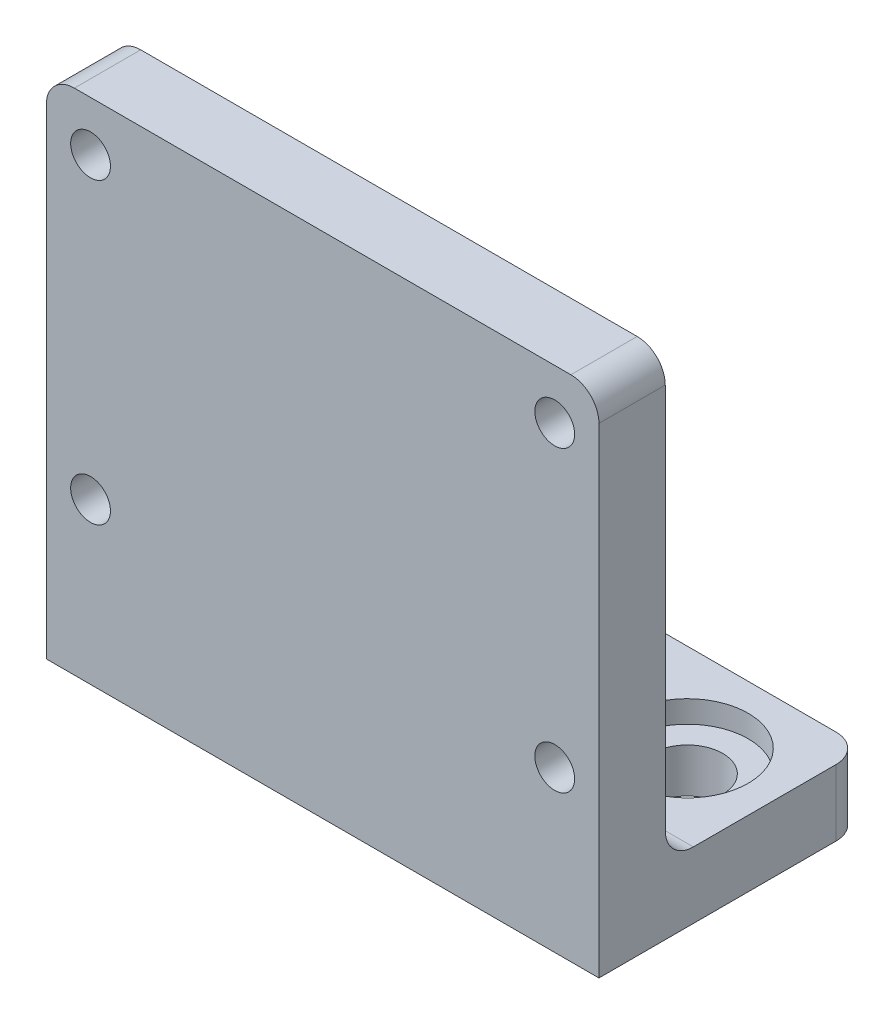
ISO-10303-21;
HEADER;
FILE_DESCRIPTION(('STEP AP214'),'2;1');
FILE_NAME('part.step','',(''),(''),'','','');
FILE_SCHEMA(('AUTOMOTIVE_DESIGN { 1 0 10303 214 1 1 1 1 }'));
ENDSEC;
DATA;
#1=APPLICATION_CONTEXT('core data for automotive mechanical design processes');
#2=APPLICATION_PROTOCOL_DEFINITION('international standard','automotive_design',2000,#1);
#3=PRODUCT_CONTEXT('',#1,'mechanical');
#4=PRODUCT('Part','Part','',(#3));
#5=PRODUCT_RELATED_PRODUCT_CATEGORY('part','',(#4));
#6=PRODUCT_DEFINITION_FORMATION('','',#4);
#7=PRODUCT_DEFINITION_CONTEXT('part definition',#1,'design');
#8=PRODUCT_DEFINITION('design','',#6,#7);
#9=PRODUCT_DEFINITION_SHAPE('','',#8);
#10=(LENGTH_UNIT() NAMED_UNIT(*) SI_UNIT(.MILLI.,.METRE.));
#11=(NAMED_UNIT(*) PLANE_ANGLE_UNIT() SI_UNIT($,.RADIAN.));
#12=(NAMED_UNIT(*) SI_UNIT($,.STERADIAN.) SOLID_ANGLE_UNIT());
#13=UNCERTAINTY_MEASURE_WITH_UNIT(LENGTH_MEASURE(1.E-05),#10,'distance_accuracy_value','');
#14=(GEOMETRIC_REPRESENTATION_CONTEXT(3) GLOBAL_UNCERTAINTY_ASSIGNED_CONTEXT((#13)) GLOBAL_UNIT_ASSIGNED_CONTEXT((#10,
#11,#12)) REPRESENTATION_CONTEXT('',''));
#15=CARTESIAN_POINT('',(0.,0.,0.));
#16=DIRECTION('',(0.,0.,1.));
#17=DIRECTION('',(1.,0.,0.));
#18=AXIS2_PLACEMENT_3D('',#15,#16,#17);
#19=CARTESIAN_POINT('',(-12.5,-14.,-3.));
#20=DIRECTION('',(-1.,0.,0.));
#21=DIRECTION('',(0.,0.,1.));
#22=AXIS2_PLACEMENT_3D('',#19,#20,#21);
#23=PLANE('',#22);
#24=DIRECTION('',(0.,0.,1.));
#25=VECTOR('',#24,1.);
#26=CARTESIAN_POINT('',(-12.5,-11.,-12.));
#27=LINE('',#26,#25);
#28=CARTESIAN_POINT('',(-12.5,-11.,-10.73));
#29=VERTEX_POINT('',#28);
#30=CARTESIAN_POINT('',(-12.5,-11.,-4.27));
#31=VERTEX_POINT('',#30);
#32=EDGE_CURVE('E384',#29,#31,#27,.T.);
#33=ORIENTED_EDGE('',*,*,#32,.F.);
#34=DIRECTION('',(0.,1.,0.));
#35=VECTOR('',#34,1.);
#36=CARTESIAN_POINT('',(-12.5,-14.,-10.73));
#37=LINE('',#36,#35);
#38=CARTESIAN_POINT('',(-12.5,-14.,-10.73));
#39=VERTEX_POINT('',#38);
#40=EDGE_CURVE('E181',#29,#39,#37,.F.);
#41=ORIENTED_EDGE('',*,*,#40,.T.);
#42=DIRECTION('',(0.,0.,1.));
#43=VECTOR('',#42,1.);
#44=CARTESIAN_POINT('',(-12.5,-14.,-3.));
#45=LINE('',#44,#43);
#46=CARTESIAN_POINT('',(-12.5,-14.,0.));
#47=VERTEX_POINT('',#46);
#48=EDGE_CURVE('E178',#39,#47,#45,.T.);
#49=ORIENTED_EDGE('',*,*,#48,.T.);
#50=DIRECTION('',(0.,-1.,0.));
#51=VECTOR('',#50,1.);
#52=CARTESIAN_POINT('',(-12.5,-14.,0.));
#53=LINE('',#52,#51);
#54=CARTESIAN_POINT('',(-12.5,7.73000000000001,0.));
#55=VERTEX_POINT('',#54);
#56=EDGE_CURVE('E164',#55,#47,#53,.T.);
#57=ORIENTED_EDGE('',*,*,#56,.F.);
#58=DIRECTION('',(0.,0.,1.));
#59=VECTOR('',#58,1.);
#60=CARTESIAN_POINT('',(-12.5,7.73000000000001,-3.));
#61=LINE('',#60,#59);
#62=CARTESIAN_POINT('',(-12.5,7.73000000000001,-3.));
#63=VERTEX_POINT('',#62);
#64=EDGE_CURVE('E279',#55,#63,#61,.F.);
#65=ORIENTED_EDGE('',*,*,#64,.T.);
#66=DIRECTION('',(0.,1.,0.));
#67=VECTOR('',#66,1.);
#68=CARTESIAN_POINT('',(-12.5,-11.,-3.));
#69=LINE('',#68,#67);
#70=CARTESIAN_POINT('',(-12.5,-9.72999999999998,-3.));
#71=VERTEX_POINT('',#70);
#72=EDGE_CURVE('E389',#71,#63,#69,.T.);
#73=ORIENTED_EDGE('',*,*,#72,.F.);
#74=CARTESIAN_POINT('',(-12.5,-9.72999999999998,-4.27));
#75=DIRECTION('',(-1.,0.,0.));
#76=DIRECTION('',(0.,0.,1.));
#77=AXIS2_PLACEMENT_3D('',#74,#75,#76);
#78=CIRCLE('',#77,1.27);
#79=EDGE_CURVE('E12',#71,#31,#78,.F.);
#80=ORIENTED_EDGE('',*,*,#79,.T.);
#81=EDGE_LOOP('',(#33,#41,#49,#57,#65,#73,#80));
#82=FACE_BOUND('',#81,.T.);
#83=ADVANCED_FACE('F41',(#82),#23,.T.);
#84=CARTESIAN_POINT('',(-12.5,9.00000000000001,-3.));
#85=DIRECTION('',(0.,1.,0.));
#86=DIRECTION('',(0.,0.,1.));
#87=AXIS2_PLACEMENT_3D('',#84,#85,#86);
#88=PLANE('',#87);
#89=DIRECTION('',(1.,0.,0.));
#90=VECTOR('',#89,1.);
#91=CARTESIAN_POINT('',(-1.,9.00000000000001,-3.));
#92=LINE('',#91,#90);
#93=CARTESIAN_POINT('',(-11.23,9.00000000000001,-3.));
#94=VERTEX_POINT('',#93);
#95=CARTESIAN_POINT('',(-2.27,9.00000000000001,-3.));
#96=VERTEX_POINT('',#95);
#97=EDGE_CURVE('E385',#94,#96,#92,.T.);
#98=ORIENTED_EDGE('',*,*,#97,.F.);
#99=DIRECTION('',(0.,0.,1.));
#100=VECTOR('',#99,1.);
#101=CARTESIAN_POINT('',(-11.23,9.00000000000001,-3.));
#102=LINE('',#101,#100);
#103=CARTESIAN_POINT('',(-11.23,9.00000000000001,0.));
#104=VERTEX_POINT('',#103);
#105=EDGE_CURVE('E301',#94,#104,#102,.T.);
#106=ORIENTED_EDGE('',*,*,#105,.T.);
#107=DIRECTION('',(-1.,0.,0.));
#108=VECTOR('',#107,1.);
#109=CARTESIAN_POINT('',(-12.5,9.00000000000001,0.));
#110=LINE('',#109,#108);
#111=CARTESIAN_POINT('',(11.23,9.00000000000001,0.));
#112=VERTEX_POINT('',#111);
#113=EDGE_CURVE('E195',#112,#104,#110,.T.);
#114=ORIENTED_EDGE('',*,*,#113,.F.);
#115=DIRECTION('',(0.,0.,1.));
#116=VECTOR('',#115,1.);
#117=CARTESIAN_POINT('',(11.23,9.00000000000001,-3.));
#118=LINE('',#117,#116);
#119=CARTESIAN_POINT('',(11.23,9.00000000000001,-3.));
#120=VERTEX_POINT('',#119);
#121=EDGE_CURVE('E298',#112,#120,#118,.F.);
#122=ORIENTED_EDGE('',*,*,#121,.T.);
#123=DIRECTION('',(-1.,0.,0.));
#124=VECTOR('',#123,1.);
#125=CARTESIAN_POINT('',(-12.5,9.00000000000001,-3.));
#126=LINE('',#125,#124);
#127=CARTESIAN_POINT('',(2.27,9.00000000000001,-3.));
#128=VERTEX_POINT('',#127);
#129=EDGE_CURVE('E186',#120,#128,#126,.T.);
#130=ORIENTED_EDGE('',*,*,#129,.T.);
#131=EDGE_CURVE('E60',#128,#96,#126,.T.);
#132=ORIENTED_EDGE('',*,*,#131,.T.);
#133=EDGE_LOOP('',(#98,#106,#114,#122,#130,#132));
#134=FACE_BOUND('',#133,.T.);
#135=ADVANCED_FACE('F446',(#134),#88,.T.);
#136=CARTESIAN_POINT('',(12.5,-14.,-3.));
#137=DIRECTION('',(1.,0.,0.));
#138=DIRECTION('',(0.,0.,-1.));
#139=AXIS2_PLACEMENT_3D('',#136,#137,#138);
#140=PLANE('',#139);
#141=DIRECTION('',(0.,0.,1.));
#142=VECTOR('',#141,1.);
#143=CARTESIAN_POINT('',(12.5,-14.,-3.));
#144=LINE('',#143,#142);
#145=CARTESIAN_POINT('',(12.5,-14.,-10.73));
#146=VERTEX_POINT('',#145);
#147=CARTESIAN_POINT('',(12.5,-14.,0.));
#148=VERTEX_POINT('',#147);
#149=EDGE_CURVE('E185',#146,#148,#144,.T.);
#150=ORIENTED_EDGE('',*,*,#149,.F.);
#151=DIRECTION('',(0.,1.,0.));
#152=VECTOR('',#151,1.);
#153=CARTESIAN_POINT('',(12.5,-11.,-10.73));
#154=LINE('',#153,#152);
#155=CARTESIAN_POINT('',(12.5,-11.,-10.73));
#156=VERTEX_POINT('',#155);
#157=EDGE_CURVE('E294',#146,#156,#154,.T.);
#158=ORIENTED_EDGE('',*,*,#157,.T.);
#159=DIRECTION('',(0.,0.,-1.));
#160=VECTOR('',#159,1.);
#161=CARTESIAN_POINT('',(12.5,-11.,-3.));
#162=LINE('',#161,#160);
#163=CARTESIAN_POINT('',(12.5,-11.,-4.27));
#164=VERTEX_POINT('',#163);
#165=EDGE_CURVE('E400',#164,#156,#162,.T.);
#166=ORIENTED_EDGE('',*,*,#165,.F.);
#167=CARTESIAN_POINT('',(12.5,-9.72999999999998,-4.27));
#168=DIRECTION('',(1.,0.,0.));
#169=DIRECTION('',(0.,0.,-1.));
#170=AXIS2_PLACEMENT_3D('',#167,#168,#169);
#171=CIRCLE('',#170,1.27);
#172=CARTESIAN_POINT('',(12.5,-9.72999999999998,-3.));
#173=VERTEX_POINT('',#172);
#174=EDGE_CURVE('E317',#164,#173,#171,.F.);
#175=ORIENTED_EDGE('',*,*,#174,.T.);
#176=DIRECTION('',(0.,1.,0.));
#177=VECTOR('',#176,1.);
#178=CARTESIAN_POINT('',(12.5,-11.,-3.));
#179=LINE('',#178,#177);
#180=CARTESIAN_POINT('',(12.5,7.73000000000001,-3.));
#181=VERTEX_POINT('',#180);
#182=EDGE_CURVE('E391',#173,#181,#179,.T.);
#183=ORIENTED_EDGE('',*,*,#182,.T.);
#184=DIRECTION('',(0.,0.,1.));
#185=VECTOR('',#184,1.);
#186=CARTESIAN_POINT('',(12.5,7.73000000000001,-3.));
#187=LINE('',#186,#185);
#188=CARTESIAN_POINT('',(12.5,7.73000000000001,0.));
#189=VERTEX_POINT('',#188);
#190=EDGE_CURVE('E290',#181,#189,#187,.T.);
#191=ORIENTED_EDGE('',*,*,#190,.T.);
#192=DIRECTION('',(0.,1.,0.));
#193=VECTOR('',#192,1.);
#194=CARTESIAN_POINT('',(12.5,-14.,0.));
#195=LINE('',#194,#193);
#196=EDGE_CURVE('E192',#148,#189,#195,.T.);
#197=ORIENTED_EDGE('',*,*,#196,.F.);
#198=EDGE_LOOP('',(#150,#158,#166,#175,#183,#191,#197));
#199=FACE_BOUND('',#198,.T.);
#200=ADVANCED_FACE('F457',(#199),#140,.T.);
#201=CARTESIAN_POINT('',(-12.5,-14.,-3.));
#202=DIRECTION('',(0.,-1.,0.));
#203=DIRECTION('',(0.,0.,-1.));
#204=AXIS2_PLACEMENT_3D('',#201,#202,#203);
#205=PLANE('',#204);
#206=CARTESIAN_POINT('',(-8.49999999999996,-14.,-8.));
#207=DIRECTION('',(0.,1.,0.));
#208=DIRECTION('',(0.,0.,1.));
#209=AXIS2_PLACEMENT_3D('',#206,#207,#208);
#210=CIRCLE('',#209,1.6);
#211=CARTESIAN_POINT('',(-8.49999999999996,-14.,-6.4));
#212=VERTEX_POINT('',#211);
#213=EDGE_CURVE('E404',#212,#212,#210,.T.);
#214=ORIENTED_EDGE('',*,*,#213,.T.);
#215=EDGE_LOOP('',(#214));
#216=FACE_BOUND('',#215,.T.);
#217=CARTESIAN_POINT('',(8.49999999999996,-14.,-8.));
#218=DIRECTION('',(0.,1.,0.));
#219=DIRECTION('',(0.,0.,-1.));
#220=AXIS2_PLACEMENT_3D('',#217,#218,#219);
#221=CIRCLE('',#220,1.6);
#222=CARTESIAN_POINT('',(8.49999999999996,-14.,-9.6));
#223=VERTEX_POINT('',#222);
#224=EDGE_CURVE('E221',#223,#223,#221,.T.);
#225=ORIENTED_EDGE('',*,*,#224,.T.);
#226=EDGE_LOOP('',(#225));
#227=FACE_BOUND('',#226,.T.);
#228=ORIENTED_EDGE('',*,*,#48,.F.);
#229=CARTESIAN_POINT('',(-11.23,-14.,-10.73));
#230=DIRECTION('',(0.,-1.,0.));
#231=DIRECTION('',(0.,0.,-1.));
#232=AXIS2_PLACEMENT_3D('',#229,#230,#231);
#233=CIRCLE('',#232,1.27);
#234=CARTESIAN_POINT('',(-11.23,-14.,-12.));
#235=VERTEX_POINT('',#234);
#236=EDGE_CURVE('E287',#39,#235,#233,.T.);
#237=ORIENTED_EDGE('',*,*,#236,.T.);
#238=DIRECTION('',(-1.,0.,0.));
#239=VECTOR('',#238,1.);
#240=CARTESIAN_POINT('',(37.1981780704569,-14.,-12.));
#241=LINE('',#240,#239);
#242=CARTESIAN_POINT('',(11.23,-14.,-12.));
#243=VERTEX_POINT('',#242);
#244=EDGE_CURVE('E408',#243,#235,#241,.T.);
#245=ORIENTED_EDGE('',*,*,#244,.F.);
#246=CARTESIAN_POINT('',(11.23,-14.,-10.73));
#247=DIRECTION('',(0.,-1.,0.));
#248=DIRECTION('',(0.,0.,-1.));
#249=AXIS2_PLACEMENT_3D('',#246,#247,#248);
#250=CIRCLE('',#249,1.27);
#251=EDGE_CURVE('E284',#243,#146,#250,.T.);
#252=ORIENTED_EDGE('',*,*,#251,.T.);
#253=ORIENTED_EDGE('',*,*,#149,.T.);
#254=DIRECTION('',(1.,0.,0.));
#255=VECTOR('',#254,1.);
#256=CARTESIAN_POINT('',(-12.5,-14.,0.));
#257=LINE('',#256,#255);
#258=EDGE_CURVE('E170',#47,#148,#257,.T.);
#259=ORIENTED_EDGE('',*,*,#258,.F.);
#260=EDGE_LOOP('',(#228,#237,#245,#252,#253,#259));
#261=FACE_BOUND('',#260,.T.);
#262=ADVANCED_FACE('F188',(#216,#227,#261),#205,.T.);
#263=CARTESIAN_POINT('',(0.,0.,0.));
#264=DIRECTION('',(0.,0.,-1.));
#265=DIRECTION('',(-1.,0.,0.));
#266=AXIS2_PLACEMENT_3D('',#263,#264,#265);
#267=PLANE('',#266);
#268=CARTESIAN_POINT('',(-10.5,-6.75000000000001,0.));
#269=DIRECTION('',(0.,0.,1.));
#270=DIRECTION('',(1.,0.,0.));
#271=AXIS2_PLACEMENT_3D('',#268,#269,#270);
#272=CIRCLE('',#271,0.90000000000001);
#273=CARTESIAN_POINT('',(-9.59999999999995,-6.75000000000001,0.));
#274=VERTEX_POINT('',#273);
#275=EDGE_CURVE('E415',#274,#274,#272,.T.);
#276=ORIENTED_EDGE('',*,*,#275,.F.);
#277=EDGE_LOOP('',(#276));
#278=FACE_BOUND('',#277,.T.);
#279=CARTESIAN_POINT('',(10.5,-6.75000000000001,0.));
#280=DIRECTION('',(0.,0.,1.));
#281=DIRECTION('',(1.,0.,0.));
#282=AXIS2_PLACEMENT_3D('',#279,#280,#281);
#283=CIRCLE('',#282,0.90000000000001);
#284=CARTESIAN_POINT('',(11.4,-6.75000000000001,0.));
#285=VERTEX_POINT('',#284);
#286=EDGE_CURVE('E424',#285,#285,#283,.T.);
#287=ORIENTED_EDGE('',*,*,#286,.F.);
#288=EDGE_LOOP('',(#287));
#289=FACE_BOUND('',#288,.T.);
#290=CARTESIAN_POINT('',(10.5,6.75000000000001,0.));
#291=DIRECTION('',(0.,0.,1.));
#292=DIRECTION('',(1.,0.,0.));
#293=AXIS2_PLACEMENT_3D('',#290,#291,#292);
#294=CIRCLE('',#293,0.90000000000001);
#295=CARTESIAN_POINT('',(11.4,6.75000000000001,0.));
#296=VERTEX_POINT('',#295);
#297=EDGE_CURVE('E431',#296,#296,#294,.T.);
#298=ORIENTED_EDGE('',*,*,#297,.F.);
#299=EDGE_LOOP('',(#298));
#300=FACE_BOUND('',#299,.T.);
#301=CARTESIAN_POINT('',(-10.5,6.75000000000001,0.));
#302=DIRECTION('',(0.,0.,1.));
#303=DIRECTION('',(1.,0.,0.));
#304=AXIS2_PLACEMENT_3D('',#301,#302,#303);
#305=CIRCLE('',#304,0.90000000000001);
#306=CARTESIAN_POINT('',(-9.59999999999995,6.75000000000001,0.));
#307=VERTEX_POINT('',#306);
#308=EDGE_CURVE('E175',#307,#307,#305,.T.);
#309=ORIENTED_EDGE('',*,*,#308,.F.);
#310=EDGE_LOOP('',(#309));
#311=FACE_BOUND('',#310,.T.);
#312=ORIENTED_EDGE('',*,*,#113,.T.);
#313=CARTESIAN_POINT('',(-11.23,7.73000000000001,0.));
#314=DIRECTION('',(0.,0.,-1.));
#315=DIRECTION('',(-1.,0.,0.));
#316=AXIS2_PLACEMENT_3D('',#313,#314,#315);
#317=CIRCLE('',#316,1.27);
#318=EDGE_CURVE('E171',#104,#55,#317,.F.);
#319=ORIENTED_EDGE('',*,*,#318,.T.);
#320=ORIENTED_EDGE('',*,*,#56,.T.);
#321=ORIENTED_EDGE('',*,*,#258,.T.);
#322=ORIENTED_EDGE('',*,*,#196,.T.);
#323=CARTESIAN_POINT('',(11.23,7.73000000000001,0.));
#324=DIRECTION('',(0.,0.,-1.));
#325=DIRECTION('',(-1.,0.,0.));
#326=AXIS2_PLACEMENT_3D('',#323,#324,#325);
#327=CIRCLE('',#326,1.27);
#328=EDGE_CURVE('E305',#189,#112,#327,.F.);
#329=ORIENTED_EDGE('',*,*,#328,.T.);
#330=EDGE_LOOP('',(#312,#319,#320,#321,#322,#329));
#331=FACE_BOUND('',#330,.T.);
#332=ADVANCED_FACE('F167',(#278,#289,#300,#311,#331),#267,.F.);
#333=CARTESIAN_POINT('',(-10.5,6.75000000000001,-3.));
#334=DIRECTION('',(0.,0.,1.));
#335=DIRECTION('',(1.,0.,0.));
#336=AXIS2_PLACEMENT_3D('',#333,#334,#335);
#337=CYLINDRICAL_SURFACE('',#336,0.90000000000001);
#338=CARTESIAN_POINT('',(-10.5,6.75000000000001,-3.));
#339=DIRECTION('',(0.,0.,1.));
#340=DIRECTION('',(1.,0.,0.));
#341=AXIS2_PLACEMENT_3D('',#338,#339,#340);
#342=CIRCLE('',#341,0.90000000000001);
#343=CARTESIAN_POINT('',(-9.59999999999995,6.75000000000001,-3.));
#344=VERTEX_POINT('',#343);
#345=EDGE_CURVE('E411',#344,#344,#342,.T.);
#346=ORIENTED_EDGE('',*,*,#345,.F.);
#347=EDGE_LOOP('',(#346));
#348=FACE_BOUND('',#347,.T.);
#349=ORIENTED_EDGE('',*,*,#308,.T.);
#350=EDGE_LOOP('',(#349));
#351=FACE_BOUND('',#350,.T.);
#352=ADVANCED_FACE('F684',(#348,#351),#337,.F.);
#353=CARTESIAN_POINT('',(10.5,6.75000000000001,-3.));
#354=DIRECTION('',(0.,0.,1.));
#355=DIRECTION('',(1.,0.,0.));
#356=AXIS2_PLACEMENT_3D('',#353,#354,#355);
#357=CYLINDRICAL_SURFACE('',#356,0.90000000000001);
#358=CARTESIAN_POINT('',(10.5,6.75000000000001,-3.));
#359=DIRECTION('',(0.,0.,1.));
#360=DIRECTION('',(1.,0.,0.));
#361=AXIS2_PLACEMENT_3D('',#358,#359,#360);
#362=CIRCLE('',#361,0.90000000000001);
#363=CARTESIAN_POINT('',(11.4,6.75000000000001,-3.));
#364=VERTEX_POINT('',#363);
#365=EDGE_CURVE('E420',#364,#364,#362,.T.);
#366=ORIENTED_EDGE('',*,*,#365,.F.);
#367=EDGE_LOOP('',(#366));
#368=FACE_BOUND('',#367,.T.);
#369=ORIENTED_EDGE('',*,*,#297,.T.);
#370=EDGE_LOOP('',(#369));
#371=FACE_BOUND('',#370,.T.);
#372=ADVANCED_FACE('F786',(#368,#371),#357,.F.);
#373=CARTESIAN_POINT('',(10.5,-6.75000000000001,-3.));
#374=DIRECTION('',(0.,0.,1.));
#375=DIRECTION('',(1.,0.,0.));
#376=AXIS2_PLACEMENT_3D('',#373,#374,#375);
#377=CYLINDRICAL_SURFACE('',#376,0.90000000000001);
#378=CARTESIAN_POINT('',(10.5,-6.75000000000001,-3.));
#379=DIRECTION('',(0.,0.,1.));
#380=DIRECTION('',(1.,0.,0.));
#381=AXIS2_PLACEMENT_3D('',#378,#379,#380);
#382=CIRCLE('',#381,0.90000000000001);
#383=CARTESIAN_POINT('',(11.4,-6.75000000000001,-3.));
#384=VERTEX_POINT('',#383);
#385=EDGE_CURVE('E399',#384,#384,#382,.T.);
#386=ORIENTED_EDGE('',*,*,#385,.F.);
#387=EDGE_LOOP('',(#386));
#388=FACE_BOUND('',#387,.T.);
#389=ORIENTED_EDGE('',*,*,#286,.T.);
#390=EDGE_LOOP('',(#389));
#391=FACE_BOUND('',#390,.T.);
#392=ADVANCED_FACE('F776',(#388,#391),#377,.F.);
#393=CARTESIAN_POINT('',(-10.5,-6.75000000000001,-3.));
#394=DIRECTION('',(0.,0.,1.));
#395=DIRECTION('',(1.,0.,0.));
#396=AXIS2_PLACEMENT_3D('',#393,#394,#395);
#397=CYLINDRICAL_SURFACE('',#396,0.90000000000001);
#398=CARTESIAN_POINT('',(-10.5,-6.75000000000001,-3.));
#399=DIRECTION('',(0.,0.,1.));
#400=DIRECTION('',(1.,0.,0.));
#401=AXIS2_PLACEMENT_3D('',#398,#399,#400);
#402=CIRCLE('',#401,0.90000000000001);
#403=CARTESIAN_POINT('',(-9.59999999999995,-6.75000000000001,-3.));
#404=VERTEX_POINT('',#403);
#405=EDGE_CURVE('E416',#404,#404,#402,.T.);
#406=ORIENTED_EDGE('',*,*,#405,.F.);
#407=EDGE_LOOP('',(#406));
#408=FACE_BOUND('',#407,.T.);
#409=ORIENTED_EDGE('',*,*,#275,.T.);
#410=EDGE_LOOP('',(#409));
#411=FACE_BOUND('',#410,.T.);
#412=ADVANCED_FACE('F673',(#408,#411),#397,.F.);
#413=CARTESIAN_POINT('',(37.1981780704569,-11.,-12.));
#414=DIRECTION('',(0.,0.,1.));
#415=DIRECTION('',(0.,-1.,0.));
#416=AXIS2_PLACEMENT_3D('',#413,#414,#415);
#417=PLANE('',#416);
#418=ORIENTED_EDGE('',*,*,#244,.T.);
#419=DIRECTION('',(0.,1.,0.));
#420=VECTOR('',#419,1.);
#421=CARTESIAN_POINT('',(-11.23,-11.,-12.));
#422=LINE('',#421,#420);
#423=CARTESIAN_POINT('',(-11.23,-11.,-12.));
#424=VERTEX_POINT('',#423);
#425=EDGE_CURVE('E275',#235,#424,#422,.T.);
#426=ORIENTED_EDGE('',*,*,#425,.T.);
#427=DIRECTION('',(-1.,0.,0.));
#428=VECTOR('',#427,1.);
#429=CARTESIAN_POINT('',(-1.,-11.,-12.));
#430=LINE('',#429,#428);
#431=CARTESIAN_POINT('',(-2.27,-11.,-12.));
#432=VERTEX_POINT('',#431);
#433=EDGE_CURVE('E375',#432,#424,#430,.T.);
#434=ORIENTED_EDGE('',*,*,#433,.F.);
#435=DIRECTION('',(-1.,0.,0.));
#436=VECTOR('',#435,1.);
#437=CARTESIAN_POINT('',(37.1981780704569,-11.,-12.));
#438=LINE('',#437,#436);
#439=CARTESIAN_POINT('',(2.27,-11.,-12.));
#440=VERTEX_POINT('',#439);
#441=EDGE_CURVE('E367',#440,#432,#438,.T.);
#442=ORIENTED_EDGE('',*,*,#441,.F.);
#443=CARTESIAN_POINT('',(11.23,-11.,-12.));
#444=VERTEX_POINT('',#443);
#445=EDGE_CURVE('E412',#444,#440,#438,.T.);
#446=ORIENTED_EDGE('',*,*,#445,.F.);
#447=DIRECTION('',(0.,1.,0.));
#448=VECTOR('',#447,1.);
#449=CARTESIAN_POINT('',(11.23,-14.,-12.));
#450=LINE('',#449,#448);
#451=EDGE_CURVE('E272',#444,#243,#450,.F.);
#452=ORIENTED_EDGE('',*,*,#451,.T.);
#453=EDGE_LOOP('',(#418,#426,#434,#442,#446,#452));
#454=FACE_BOUND('',#453,.T.);
#455=ADVANCED_FACE('F379',(#454),#417,.F.);
#456=CARTESIAN_POINT('',(37.1981780704569,9.00000000000001,-3.));
#457=DIRECTION('',(0.,-0.410364677328798,0.911921505175106));
#458=DIRECTION('',(0.,-0.911921505175106,-0.410364677328798));
#459=AXIS2_PLACEMENT_3D('',#456,#457,#458);
#460=PLANE('',#459);
#461=ORIENTED_EDGE('',*,*,#441,.T.);
#462=CARTESIAN_POINT('',(-2.27,-9.72999999999998,-11.4285));
#463=DIRECTION('',(0.,-0.410364677328798,0.911921505175106));
#464=DIRECTION('',(0.,0.911921505175106,0.410364677328798));
#465=AXIS2_PLACEMENT_3D('',#462,#463,#464);
#466=ELLIPSE('',#465,1.39266372466579,1.27);
#467=CARTESIAN_POINT('',(-1.,-9.72999999999998,-11.4285));
#468=VERTEX_POINT('',#467);
#469=EDGE_CURVE('E52',#432,#468,#466,.T.);
#470=ORIENTED_EDGE('',*,*,#469,.T.);
#471=DIRECTION('',(0.,0.911921505175106,0.410364677328798));
#472=VECTOR('',#471,1.);
#473=CARTESIAN_POINT('',(-1.,9.00000000000001,-3.));
#474=LINE('',#473,#472);
#475=CARTESIAN_POINT('',(-1.,6.17777777777779,-4.27));
#476=VERTEX_POINT('',#475);
#477=EDGE_CURVE('E207',#468,#476,#474,.T.);
#478=ORIENTED_EDGE('',*,*,#477,.T.);
#479=CARTESIAN_POINT('',(-2.27,6.17777777777779,-4.27));
#480=DIRECTION('',(0.,-0.410364677328798,0.911921505175106));
#481=DIRECTION('',(0.,-0.911921505175106,-0.410364677328798));
#482=AXIS2_PLACEMENT_3D('',#479,#480,#481);
#483=ELLIPSE('',#482,3.09480827703509,1.27);
#484=EDGE_CURVE('E320',#476,#96,#483,.T.);
#485=ORIENTED_EDGE('',*,*,#484,.T.);
#486=ORIENTED_EDGE('',*,*,#131,.F.);
#487=CARTESIAN_POINT('',(2.27,6.17777777777779,-4.27));
#488=DIRECTION('',(0.,-0.410364677328798,0.911921505175106));
#489=DIRECTION('',(0.,-0.911921505175106,-0.410364677328798));
#490=AXIS2_PLACEMENT_3D('',#487,#488,#489);
#491=ELLIPSE('',#490,3.09480827703509,1.27);
#492=CARTESIAN_POINT('',(1.,6.17777777777778,-4.27));
#493=VERTEX_POINT('',#492);
#494=EDGE_CURVE('E310',#128,#493,#491,.T.);
#495=ORIENTED_EDGE('',*,*,#494,.T.);
#496=DIRECTION('',(0.,-0.911921505175106,-0.410364677328798));
#497=VECTOR('',#496,1.);
#498=CARTESIAN_POINT('',(1.,9.00000000000001,-3.));
#499=LINE('',#498,#497);
#500=CARTESIAN_POINT('',(1.,-9.72999999999998,-11.4285));
#501=VERTEX_POINT('',#500);
#502=EDGE_CURVE('E202',#493,#501,#499,.T.);
#503=ORIENTED_EDGE('',*,*,#502,.T.);
#504=CARTESIAN_POINT('',(2.27,-9.72999999999998,-11.4285));
#505=DIRECTION('',(0.,-0.410364677328798,0.911921505175106));
#506=DIRECTION('',(0.,0.911921505175106,0.410364677328798));
#507=AXIS2_PLACEMENT_3D('',#504,#505,#506);
#508=ELLIPSE('',#507,1.39266372466579,1.27);
#509=EDGE_CURVE('E313',#501,#440,#508,.T.);
#510=ORIENTED_EDGE('',*,*,#509,.T.);
#511=EDGE_LOOP('',(#461,#470,#478,#485,#486,#495,#503,#510));
#512=FACE_BOUND('',#511,.T.);
#513=ADVANCED_FACE('F365',(#512),#460,.F.);
#514=CARTESIAN_POINT('',(1.,-11.,-3.));
#515=DIRECTION('',(-1.,0.,0.));
#516=DIRECTION('',(0.,0.,1.));
#517=AXIS2_PLACEMENT_3D('',#514,#515,#516);
#518=PLANE('',#517);
#519=ORIENTED_EDGE('',*,*,#502,.F.);
#520=DIRECTION('',(0.,1.,0.));
#521=VECTOR('',#520,1.);
#522=CARTESIAN_POINT('',(1.,-11.,-4.27));
#523=LINE('',#522,#521);
#524=CARTESIAN_POINT('',(1.,-9.72999999999998,-4.27));
#525=VERTEX_POINT('',#524);
#526=EDGE_CURVE('E234',#493,#525,#523,.F.);
#527=ORIENTED_EDGE('',*,*,#526,.T.);
#528=DIRECTION('',(0.,0.,1.));
#529=VECTOR('',#528,1.);
#530=CARTESIAN_POINT('',(1.,-9.72999999999998,-3.));
#531=LINE('',#530,#529);
#532=EDGE_CURVE('E231',#525,#501,#531,.F.);
#533=ORIENTED_EDGE('',*,*,#532,.T.);
#534=EDGE_LOOP('',(#519,#527,#533));
#535=FACE_BOUND('',#534,.T.);
#536=ADVANCED_FACE('F499',(#535),#518,.F.);
#537=CARTESIAN_POINT('',(12.5,-11.,-3.));
#538=DIRECTION('',(0.,0.,1.));
#539=DIRECTION('',(1.,0.,0.));
#540=AXIS2_PLACEMENT_3D('',#537,#538,#539);
#541=PLANE('',#540);
#542=ORIENTED_EDGE('',*,*,#365,.T.);
#543=EDGE_LOOP('',(#542));
#544=FACE_BOUND('',#543,.T.);
#545=ORIENTED_EDGE('',*,*,#385,.T.);
#546=EDGE_LOOP('',(#545));
#547=FACE_BOUND('',#546,.T.);
#548=DIRECTION('',(1.,0.,0.));
#549=VECTOR('',#548,1.);
#550=CARTESIAN_POINT('',(12.5,-9.72999999999998,-3.));
#551=LINE('',#550,#549);
#552=CARTESIAN_POINT('',(2.27,-9.72999999999998,-3.));
#553=VERTEX_POINT('',#552);
#554=EDGE_CURVE('E224',#173,#553,#551,.F.);
#555=ORIENTED_EDGE('',*,*,#554,.T.);
#556=DIRECTION('',(0.,1.,0.));
#557=VECTOR('',#556,1.);
#558=CARTESIAN_POINT('',(2.27,9.00000000000001,-3.));
#559=LINE('',#558,#557);
#560=EDGE_CURVE('E227',#553,#128,#559,.T.);
#561=ORIENTED_EDGE('',*,*,#560,.T.);
#562=ORIENTED_EDGE('',*,*,#129,.F.);
#563=CARTESIAN_POINT('',(11.23,7.73000000000001,-3.));
#564=DIRECTION('',(0.,0.,1.));
#565=DIRECTION('',(1.,0.,0.));
#566=AXIS2_PLACEMENT_3D('',#563,#564,#565);
#567=CIRCLE('',#566,1.27);
#568=EDGE_CURVE('E211',#120,#181,#567,.F.);
#569=ORIENTED_EDGE('',*,*,#568,.T.);
#570=ORIENTED_EDGE('',*,*,#182,.F.);
#571=EDGE_LOOP('',(#555,#561,#562,#569,#570));
#572=FACE_BOUND('',#571,.T.);
#573=ADVANCED_FACE('F451',(#544,#547,#572),#541,.F.);
#574=CARTESIAN_POINT('',(0.,-11.,0.));
#575=DIRECTION('',(0.,1.,0.));
#576=DIRECTION('',(0.,0.,1.));
#577=AXIS2_PLACEMENT_3D('',#574,#575,#576);
#578=PLANE('',#577);
#579=CARTESIAN_POINT('',(8.49999999999996,-11.,-8.));
#580=DIRECTION('',(0.,1.,0.));
#581=DIRECTION('',(0.,0.,1.));
#582=AXIS2_PLACEMENT_3D('',#579,#580,#581);
#583=CIRCLE('',#582,2.75);
#584=CARTESIAN_POINT('',(8.49999999999996,-11.,-5.25));
#585=VERTEX_POINT('',#584);
#586=EDGE_CURVE('E338',#585,#585,#583,.T.);
#587=ORIENTED_EDGE('',*,*,#586,.F.);
#588=EDGE_LOOP('',(#587));
#589=FACE_BOUND('',#588,.T.);
#590=ORIENTED_EDGE('',*,*,#445,.T.);
#591=DIRECTION('',(0.,0.,1.));
#592=VECTOR('',#591,1.);
#593=CARTESIAN_POINT('',(2.27,-11.,0.));
#594=LINE('',#593,#592);
#595=CARTESIAN_POINT('',(2.27,-11.,-4.27));
#596=VERTEX_POINT('',#595);
#597=EDGE_CURVE('E243',#440,#596,#594,.T.);
#598=ORIENTED_EDGE('',*,*,#597,.T.);
#599=DIRECTION('',(1.,0.,0.));
#600=VECTOR('',#599,1.);
#601=CARTESIAN_POINT('',(0.,-11.,-4.27));
#602=LINE('',#601,#600);
#603=EDGE_CURVE('E240',#596,#164,#602,.T.);
#604=ORIENTED_EDGE('',*,*,#603,.T.);
#605=ORIENTED_EDGE('',*,*,#165,.T.);
#606=CARTESIAN_POINT('',(11.23,-11.,-10.73));
#607=DIRECTION('',(0.,1.,0.));
#608=DIRECTION('',(0.,0.,1.));
#609=AXIS2_PLACEMENT_3D('',#606,#607,#608);
#610=CIRCLE('',#609,1.27);
#611=EDGE_CURVE('E237',#156,#444,#610,.T.);
#612=ORIENTED_EDGE('',*,*,#611,.T.);
#613=EDGE_LOOP('',(#590,#598,#604,#605,#612));
#614=FACE_BOUND('',#613,.T.);
#615=ADVANCED_FACE('F478',(#589,#614),#578,.T.);
#616=CARTESIAN_POINT('',(-1.,-11.,-12.));
#617=DIRECTION('',(1.,0.,0.));
#618=DIRECTION('',(0.,0.,-1.));
#619=AXIS2_PLACEMENT_3D('',#616,#617,#618);
#620=PLANE('',#619);
#621=DIRECTION('',(0.,0.,-1.));
#622=VECTOR('',#621,1.);
#623=CARTESIAN_POINT('',(-1.,-9.72999999999998,-3.));
#624=LINE('',#623,#622);
#625=CARTESIAN_POINT('',(-1.,-9.72999999999998,-4.27));
#626=VERTEX_POINT('',#625);
#627=EDGE_CURVE('E246',#468,#626,#624,.F.);
#628=ORIENTED_EDGE('',*,*,#627,.T.);
#629=DIRECTION('',(0.,1.,0.));
#630=VECTOR('',#629,1.);
#631=CARTESIAN_POINT('',(-1.,9.00000000000001,-4.27));
#632=LINE('',#631,#630);
#633=EDGE_CURVE('E249',#626,#476,#632,.T.);
#634=ORIENTED_EDGE('',*,*,#633,.T.);
#635=ORIENTED_EDGE('',*,*,#477,.F.);
#636=EDGE_LOOP('',(#628,#634,#635));
#637=FACE_BOUND('',#636,.T.);
#638=ADVANCED_FACE('F361',(#637),#620,.F.);
#639=CARTESIAN_POINT('',(-1.,-11.,-3.));
#640=DIRECTION('',(0.,0.,1.));
#641=DIRECTION('',(1.,0.,0.));
#642=AXIS2_PLACEMENT_3D('',#639,#640,#641);
#643=PLANE('',#642);
#644=ORIENTED_EDGE('',*,*,#345,.T.);
#645=EDGE_LOOP('',(#644));
#646=FACE_BOUND('',#645,.T.);
#647=ORIENTED_EDGE('',*,*,#405,.T.);
#648=EDGE_LOOP('',(#647));
#649=FACE_BOUND('',#648,.T.);
#650=ORIENTED_EDGE('',*,*,#97,.T.);
#651=DIRECTION('',(0.,1.,0.));
#652=VECTOR('',#651,1.);
#653=CARTESIAN_POINT('',(-2.27,-11.,-3.));
#654=LINE('',#653,#652);
#655=CARTESIAN_POINT('',(-2.27,-9.72999999999998,-3.));
#656=VERTEX_POINT('',#655);
#657=EDGE_CURVE('E259',#96,#656,#654,.F.);
#658=ORIENTED_EDGE('',*,*,#657,.T.);
#659=DIRECTION('',(1.,0.,0.));
#660=VECTOR('',#659,1.);
#661=CARTESIAN_POINT('',(-12.5,-9.72999999999998,-3.));
#662=LINE('',#661,#660);
#663=EDGE_CURVE('E256',#656,#71,#662,.F.);
#664=ORIENTED_EDGE('',*,*,#663,.T.);
#665=ORIENTED_EDGE('',*,*,#72,.T.);
#666=CARTESIAN_POINT('',(-11.23,7.73000000000001,-3.));
#667=DIRECTION('',(0.,0.,1.));
#668=DIRECTION('',(1.,0.,0.));
#669=AXIS2_PLACEMENT_3D('',#666,#667,#668);
#670=CIRCLE('',#669,1.27);
#671=EDGE_CURVE('E253',#63,#94,#670,.F.);
#672=ORIENTED_EDGE('',*,*,#671,.T.);
#673=EDGE_LOOP('',(#650,#658,#664,#665,#672));
#674=FACE_BOUND('',#673,.T.);
#675=ADVANCED_FACE('F465',(#646,#649,#674),#643,.F.);
#676=CARTESIAN_POINT('',(0.,-11.,0.));
#677=DIRECTION('',(0.,-1.,0.));
#678=DIRECTION('',(0.,0.,-1.));
#679=AXIS2_PLACEMENT_3D('',#676,#677,#678);
#680=PLANE('',#679);
#681=CARTESIAN_POINT('',(-8.49999999999996,-11.,-8.));
#682=DIRECTION('',(0.,1.,0.));
#683=DIRECTION('',(0.,0.,1.));
#684=AXIS2_PLACEMENT_3D('',#681,#682,#683);
#685=CIRCLE('',#684,2.75);
#686=CARTESIAN_POINT('',(-8.49999999999996,-11.,-5.25));
#687=VERTEX_POINT('',#686);
#688=EDGE_CURVE('E836',#687,#687,#685,.T.);
#689=ORIENTED_EDGE('',*,*,#688,.F.);
#690=EDGE_LOOP('',(#689));
#691=FACE_BOUND('',#690,.T.);
#692=DIRECTION('',(1.,0.,0.));
#693=VECTOR('',#692,1.);
#694=CARTESIAN_POINT('',(-1.,-11.,-4.27));
#695=LINE('',#694,#693);
#696=CARTESIAN_POINT('',(-2.27,-11.,-4.27));
#697=VERTEX_POINT('',#696);
#698=EDGE_CURVE('E265',#31,#697,#695,.T.);
#699=ORIENTED_EDGE('',*,*,#698,.T.);
#700=DIRECTION('',(0.,0.,-1.));
#701=VECTOR('',#700,1.);
#702=CARTESIAN_POINT('',(-2.27,-11.,-12.));
#703=LINE('',#702,#701);
#704=EDGE_CURVE('E268',#697,#432,#703,.T.);
#705=ORIENTED_EDGE('',*,*,#704,.T.);
#706=ORIENTED_EDGE('',*,*,#433,.T.);
#707=CARTESIAN_POINT('',(-11.23,-11.,-10.73));
#708=DIRECTION('',(0.,-1.,0.));
#709=DIRECTION('',(0.,0.,-1.));
#710=AXIS2_PLACEMENT_3D('',#707,#708,#709);
#711=CIRCLE('',#710,1.27);
#712=EDGE_CURVE('E262',#424,#29,#711,.F.);
#713=ORIENTED_EDGE('',*,*,#712,.T.);
#714=ORIENTED_EDGE('',*,*,#32,.T.);
#715=EDGE_LOOP('',(#699,#705,#706,#713,#714));
#716=FACE_BOUND('',#715,.T.);
#717=ADVANCED_FACE('F374',(#691,#716),#680,.F.);
#718=CARTESIAN_POINT('',(-8.49999999999996,-14.,-8.));
#719=DIRECTION('',(0.,1.,0.));
#720=DIRECTION('',(0.,0.,1.));
#721=AXIS2_PLACEMENT_3D('',#718,#719,#720);
#722=CYLINDRICAL_SURFACE('',#721,1.6);
#723=CARTESIAN_POINT('',(-8.49999999999996,-12.,-8.));
#724=DIRECTION('',(0.,-1.,0.));
#725=DIRECTION('',(0.,0.,-1.));
#726=AXIS2_PLACEMENT_3D('',#723,#724,#725);
#727=CIRCLE('',#726,1.6);
#728=CARTESIAN_POINT('',(-8.49999999999996,-12.,-9.6));
#729=VERTEX_POINT('',#728);
#730=EDGE_CURVE('E216',#729,#729,#727,.F.);
#731=ORIENTED_EDGE('',*,*,#730,.T.);
#732=EDGE_LOOP('',(#731));
#733=FACE_BOUND('',#732,.T.);
#734=ORIENTED_EDGE('',*,*,#213,.F.);
#735=EDGE_LOOP('',(#734));
#736=FACE_BOUND('',#735,.T.);
#737=ADVANCED_FACE('F619',(#733,#736),#722,.F.);
#738=CARTESIAN_POINT('',(8.49999999999996,-14.,-8.));
#739=DIRECTION('',(0.,1.,0.));
#740=DIRECTION('',(0.,0.,1.));
#741=AXIS2_PLACEMENT_3D('',#738,#739,#740);
#742=CYLINDRICAL_SURFACE('',#741,1.6);
#743=CARTESIAN_POINT('',(8.49999999999996,-12.,-8.));
#744=DIRECTION('',(0.,-1.,0.));
#745=DIRECTION('',(0.,0.,-1.));
#746=AXIS2_PLACEMENT_3D('',#743,#744,#745);
#747=CIRCLE('',#746,1.6);
#748=CARTESIAN_POINT('',(8.49999999999996,-12.,-9.6));
#749=VERTEX_POINT('',#748);
#750=EDGE_CURVE('E212',#749,#749,#747,.F.);
#751=ORIENTED_EDGE('',*,*,#750,.T.);
#752=EDGE_LOOP('',(#751));
#753=FACE_BOUND('',#752,.T.);
#754=ORIENTED_EDGE('',*,*,#224,.F.);
#755=EDGE_LOOP('',(#754));
#756=FACE_BOUND('',#755,.T.);
#757=ADVANCED_FACE('F752',(#753,#756),#742,.F.);
#758=CARTESIAN_POINT('',(-12.5,-12.,-3.));
#759=DIRECTION('',(0.,-1.,0.));
#760=DIRECTION('',(0.,0.,-1.));
#761=AXIS2_PLACEMENT_3D('',#758,#759,#760);
#762=PLANE('',#761);
#763=CARTESIAN_POINT('',(8.49999999999996,-12.,-8.));
#764=DIRECTION('',(0.,-1.,0.));
#765=DIRECTION('',(0.,0.,-1.));
#766=AXIS2_PLACEMENT_3D('',#763,#764,#765);
#767=CIRCLE('',#766,2.75);
#768=CARTESIAN_POINT('',(8.49999999999996,-12.,-10.75));
#769=VERTEX_POINT('',#768);
#770=EDGE_CURVE('E832',#769,#769,#767,.F.);
#771=ORIENTED_EDGE('',*,*,#770,.T.);
#772=EDGE_LOOP('',(#771));
#773=FACE_BOUND('',#772,.T.);
#774=ORIENTED_EDGE('',*,*,#750,.F.);
#775=EDGE_LOOP('',(#774));
#776=FACE_BOUND('',#775,.T.);
#777=ADVANCED_FACE('F742',(#773,#776),#762,.F.);
#778=CARTESIAN_POINT('',(8.49999999999996,-21.778174593052,-8.));
#779=DIRECTION('',(0.,1.,0.));
#780=DIRECTION('',(0.,0.,1.));
#781=AXIS2_PLACEMENT_3D('',#778,#779,#780);
#782=CYLINDRICAL_SURFACE('',#781,2.75);
#783=ORIENTED_EDGE('',*,*,#586,.T.);
#784=EDGE_LOOP('',(#783));
#785=FACE_BOUND('',#784,.T.);
#786=ORIENTED_EDGE('',*,*,#770,.F.);
#787=EDGE_LOOP('',(#786));
#788=FACE_BOUND('',#787,.T.);
#789=ADVANCED_FACE('F732',(#785,#788),#782,.F.);
#790=CARTESIAN_POINT('',(-12.5,-12.,-3.));
#791=DIRECTION('',(0.,-1.,0.));
#792=DIRECTION('',(0.,0.,-1.));
#793=AXIS2_PLACEMENT_3D('',#790,#791,#792);
#794=PLANE('',#793);
#795=CARTESIAN_POINT('',(-8.49999999999996,-12.,-8.));
#796=DIRECTION('',(0.,-1.,0.));
#797=DIRECTION('',(0.,0.,-1.));
#798=AXIS2_PLACEMENT_3D('',#795,#796,#797);
#799=CIRCLE('',#798,2.75);
#800=CARTESIAN_POINT('',(-8.49999999999996,-12.,-10.75));
#801=VERTEX_POINT('',#800);
#802=EDGE_CURVE('E217',#801,#801,#799,.F.);
#803=ORIENTED_EDGE('',*,*,#802,.T.);
#804=EDGE_LOOP('',(#803));
#805=FACE_BOUND('',#804,.T.);
#806=ORIENTED_EDGE('',*,*,#730,.F.);
#807=EDGE_LOOP('',(#806));
#808=FACE_BOUND('',#807,.T.);
#809=ADVANCED_FACE('F722',(#805,#808),#794,.F.);
#810=CARTESIAN_POINT('',(-8.49999999999996,-21.778174593052,-8.));
#811=DIRECTION('',(0.,1.,0.));
#812=DIRECTION('',(0.,0.,1.));
#813=AXIS2_PLACEMENT_3D('',#810,#811,#812);
#814=CYLINDRICAL_SURFACE('',#813,2.75);
#815=ORIENTED_EDGE('',*,*,#688,.T.);
#816=EDGE_LOOP('',(#815));
#817=FACE_BOUND('',#816,.T.);
#818=ORIENTED_EDGE('',*,*,#802,.F.);
#819=EDGE_LOOP('',(#818));
#820=FACE_BOUND('',#819,.T.);
#821=ADVANCED_FACE('F526',(#817,#820),#814,.F.);
#822=CARTESIAN_POINT('',(2.27,-9.72999999999998,0.));
#823=DIRECTION('',(0.,0.,1.));
#824=DIRECTION('',(1.,0.,0.));
#825=AXIS2_PLACEMENT_3D('',#822,#823,#824);
#826=CYLINDRICAL_SURFACE('',#825,1.27);
#827=ORIENTED_EDGE('',*,*,#509,.F.);
#828=ORIENTED_EDGE('',*,*,#532,.F.);
#829=CARTESIAN_POINT('',(2.27,-9.72999999999998,-4.27));
#830=DIRECTION('',(0.,0.,-1.));
#831=DIRECTION('',(-1.,0.,0.));
#832=AXIS2_PLACEMENT_3D('',#829,#830,#831);
#833=CIRCLE('',#832,1.27);
#834=EDGE_CURVE('E334',#596,#525,#833,.T.);
#835=ORIENTED_EDGE('',*,*,#834,.F.);
#836=ORIENTED_EDGE('',*,*,#597,.F.);
#837=EDGE_LOOP('',(#827,#828,#835,#836));
#838=FACE_BOUND('',#837,.T.);
#839=ADVANCED_FACE('F490',(#838),#826,.F.);
#840=CARTESIAN_POINT('',(0.,-9.72999999999998,-4.27));
#841=DIRECTION('',(1.,0.,0.));
#842=DIRECTION('',(0.,0.,-1.));
#843=AXIS2_PLACEMENT_3D('',#840,#841,#842);
#844=CYLINDRICAL_SURFACE('',#843,1.27);
#845=ORIENTED_EDGE('',*,*,#174,.F.);
#846=ORIENTED_EDGE('',*,*,#603,.F.);
#847=CARTESIAN_POINT('',(2.27,-9.72999999999998,-4.27));
#848=DIRECTION('',(1.,0.,0.));
#849=DIRECTION('',(0.,1.,0.));
#850=AXIS2_PLACEMENT_3D('',#847,#848,#849);
#851=CIRCLE('',#850,1.27);
#852=EDGE_CURVE('E330',#553,#596,#851,.T.);
#853=ORIENTED_EDGE('',*,*,#852,.F.);
#854=ORIENTED_EDGE('',*,*,#554,.F.);
#855=EDGE_LOOP('',(#845,#846,#853,#854));
#856=FACE_BOUND('',#855,.T.);
#857=ADVANCED_FACE('F484',(#856),#844,.F.);
#858=CARTESIAN_POINT('',(2.27,-9.72999999999998,-4.27));
#859=DIRECTION('',(0.,-1.,0.));
#860=DIRECTION('',(0.,0.,-1.));
#861=AXIS2_PLACEMENT_3D('',#858,#859,#860);
#862=SPHERICAL_SURFACE('',#861,1.27);
#863=ORIENTED_EDGE('',*,*,#852,.T.);
#864=ORIENTED_EDGE('',*,*,#834,.T.);
#865=CARTESIAN_POINT('',(2.27,-9.72999999999998,-4.27));
#866=DIRECTION('',(0.,1.,0.));
#867=DIRECTION('',(0.,0.,1.));
#868=AXIS2_PLACEMENT_3D('',#865,#866,#867);
#869=CIRCLE('',#868,1.27);
#870=EDGE_CURVE('E326',#553,#525,#869,.F.);
#871=ORIENTED_EDGE('',*,*,#870,.F.);
#872=EDGE_LOOP('',(#863,#864,#871));
#873=FACE_BOUND('',#872,.T.);
#874=ADVANCED_FACE('F492',(#873),#862,.F.);
#875=CARTESIAN_POINT('',(2.27,-11.,-4.27));
#876=DIRECTION('',(0.,-1.,0.));
#877=DIRECTION('',(0.,0.,-1.));
#878=AXIS2_PLACEMENT_3D('',#875,#876,#877);
#879=CYLINDRICAL_SURFACE('',#878,1.27);
#880=ORIENTED_EDGE('',*,*,#870,.T.);
#881=ORIENTED_EDGE('',*,*,#526,.F.);
#882=ORIENTED_EDGE('',*,*,#494,.F.);
#883=ORIENTED_EDGE('',*,*,#560,.F.);
#884=EDGE_LOOP('',(#880,#881,#882,#883));
#885=FACE_BOUND('',#884,.T.);
#886=ADVANCED_FACE('F496',(#885),#879,.F.);
#887=CARTESIAN_POINT('',(0.,-9.72999999999998,-4.27));
#888=DIRECTION('',(-1.,0.,0.));
#889=DIRECTION('',(0.,0.,1.));
#890=AXIS2_PLACEMENT_3D('',#887,#888,#889);
#891=CYLINDRICAL_SURFACE('',#890,1.27);
#892=ORIENTED_EDGE('',*,*,#79,.F.);
#893=ORIENTED_EDGE('',*,*,#663,.F.);
#894=CARTESIAN_POINT('',(-2.27,-9.72999999999998,-4.27));
#895=DIRECTION('',(-1.,0.,0.));
#896=DIRECTION('',(0.,0.,1.));
#897=AXIS2_PLACEMENT_3D('',#894,#895,#896);
#898=CIRCLE('',#897,1.27);
#899=EDGE_CURVE('E45',#697,#656,#898,.T.);
#900=ORIENTED_EDGE('',*,*,#899,.F.);
#901=ORIENTED_EDGE('',*,*,#698,.F.);
#902=EDGE_LOOP('',(#892,#893,#900,#901));
#903=FACE_BOUND('',#902,.T.);
#904=ADVANCED_FACE('F466',(#903),#891,.F.);
#905=CARTESIAN_POINT('',(-2.27,-9.72999999999998,0.));
#906=DIRECTION('',(0.,0.,1.));
#907=DIRECTION('',(1.,0.,0.));
#908=AXIS2_PLACEMENT_3D('',#905,#906,#907);
#909=CYLINDRICAL_SURFACE('',#908,1.27);
#910=ORIENTED_EDGE('',*,*,#469,.F.);
#911=ORIENTED_EDGE('',*,*,#704,.F.);
#912=CARTESIAN_POINT('',(-2.27,-9.72999999999998,-4.27));
#913=DIRECTION('',(0.,0.,-1.));
#914=DIRECTION('',(-1.,0.,0.));
#915=AXIS2_PLACEMENT_3D('',#912,#913,#914);
#916=CIRCLE('',#915,1.27);
#917=EDGE_CURVE('E342',#626,#697,#916,.T.);
#918=ORIENTED_EDGE('',*,*,#917,.F.);
#919=ORIENTED_EDGE('',*,*,#627,.F.);
#920=EDGE_LOOP('',(#910,#911,#918,#919));
#921=FACE_BOUND('',#920,.T.);
#922=ADVANCED_FACE('F370',(#921),#909,.F.);
#923=CARTESIAN_POINT('',(-2.27,-9.72999999999998,-4.27));
#924=DIRECTION('',(0.,-1.,0.));
#925=DIRECTION('',(0.,0.,-1.));
#926=AXIS2_PLACEMENT_3D('',#923,#924,#925);
#927=SPHERICAL_SURFACE('',#926,1.27);
#928=ORIENTED_EDGE('',*,*,#917,.T.);
#929=ORIENTED_EDGE('',*,*,#899,.T.);
#930=CARTESIAN_POINT('',(-2.27,-9.72999999999998,-4.27));
#931=DIRECTION('',(0.,1.,0.));
#932=DIRECTION('',(0.,0.,1.));
#933=AXIS2_PLACEMENT_3D('',#930,#931,#932);
#934=CIRCLE('',#933,1.27);
#935=EDGE_CURVE('E339',#626,#656,#934,.F.);
#936=ORIENTED_EDGE('',*,*,#935,.F.);
#937=EDGE_LOOP('',(#928,#929,#936));
#938=FACE_BOUND('',#937,.T.);
#939=ADVANCED_FACE('F351',(#938),#927,.F.);
#940=CARTESIAN_POINT('',(-2.27,-11.,-4.27));
#941=DIRECTION('',(0.,-1.,0.));
#942=DIRECTION('',(0.,0.,-1.));
#943=AXIS2_PLACEMENT_3D('',#940,#941,#942);
#944=CYLINDRICAL_SURFACE('',#943,1.27);
#945=ORIENTED_EDGE('',*,*,#935,.T.);
#946=ORIENTED_EDGE('',*,*,#657,.F.);
#947=ORIENTED_EDGE('',*,*,#484,.F.);
#948=ORIENTED_EDGE('',*,*,#633,.F.);
#949=EDGE_LOOP('',(#945,#946,#947,#948));
#950=FACE_BOUND('',#949,.T.);
#951=ADVANCED_FACE('F358',(#950),#944,.F.);
#952=CARTESIAN_POINT('',(-11.23,-11.,-10.73));
#953=DIRECTION('',(0.,-1.,0.));
#954=DIRECTION('',(0.,0.,-1.));
#955=AXIS2_PLACEMENT_3D('',#952,#953,#954);
#956=CYLINDRICAL_SURFACE('',#955,1.27);
#957=ORIENTED_EDGE('',*,*,#236,.F.);
#958=ORIENTED_EDGE('',*,*,#40,.F.);
#959=ORIENTED_EDGE('',*,*,#712,.F.);
#960=ORIENTED_EDGE('',*,*,#425,.F.);
#961=EDGE_LOOP('',(#957,#958,#959,#960));
#962=FACE_BOUND('',#961,.T.);
#963=ADVANCED_FACE('F468',(#962),#956,.T.);
#964=CARTESIAN_POINT('',(11.23,-14.,-10.73));
#965=DIRECTION('',(0.,-1.,0.));
#966=DIRECTION('',(0.,0.,-1.));
#967=AXIS2_PLACEMENT_3D('',#964,#965,#966);
#968=CYLINDRICAL_SURFACE('',#967,1.27);
#969=ORIENTED_EDGE('',*,*,#251,.F.);
#970=ORIENTED_EDGE('',*,*,#451,.F.);
#971=ORIENTED_EDGE('',*,*,#611,.F.);
#972=ORIENTED_EDGE('',*,*,#157,.F.);
#973=EDGE_LOOP('',(#969,#970,#971,#972));
#974=FACE_BOUND('',#973,.T.);
#975=ADVANCED_FACE('F473',(#974),#968,.T.);
#976=CARTESIAN_POINT('',(-11.23,7.73000000000001,-3.));
#977=DIRECTION('',(0.,0.,1.));
#978=DIRECTION('',(1.,0.,0.));
#979=AXIS2_PLACEMENT_3D('',#976,#977,#978);
#980=CYLINDRICAL_SURFACE('',#979,1.27);
#981=ORIENTED_EDGE('',*,*,#671,.F.);
#982=ORIENTED_EDGE('',*,*,#64,.F.);
#983=ORIENTED_EDGE('',*,*,#318,.F.);
#984=ORIENTED_EDGE('',*,*,#105,.F.);
#985=EDGE_LOOP('',(#981,#982,#983,#984));
#986=FACE_BOUND('',#985,.T.);
#987=ADVANCED_FACE('F461',(#986),#980,.T.);
#988=CARTESIAN_POINT('',(11.23,7.73000000000001,-3.));
#989=DIRECTION('',(0.,0.,1.));
#990=DIRECTION('',(1.,0.,0.));
#991=AXIS2_PLACEMENT_3D('',#988,#989,#990);
#992=CYLINDRICAL_SURFACE('',#991,1.27);
#993=ORIENTED_EDGE('',*,*,#568,.F.);
#994=ORIENTED_EDGE('',*,*,#121,.F.);
#995=ORIENTED_EDGE('',*,*,#328,.F.);
#996=ORIENTED_EDGE('',*,*,#190,.F.);
#997=EDGE_LOOP('',(#993,#994,#995,#996));
#998=FACE_BOUND('',#997,.T.);
#999=ADVANCED_FACE('F43',(#998),#992,.T.);
#1000=CLOSED_SHELL('',(#83,#135,#200,#262,#332,#352,#372,#392,#412,#455,#513,#536,#573,#615,
#638,#675,#717,#737,#757,#777,#789,#809,#821,#839,#857,#874,#886,#904,#922,#939,#951,#963,#975,
#987,#999));
#1001=MANIFOLD_SOLID_BREP('B2',#1000);
#1002=ADVANCED_BREP_SHAPE_REPRESENTATION('',(#18,#1001),#14);
#1003=SHAPE_DEFINITION_REPRESENTATION(#9,#1002);
ENDSEC;
END-ISO-10303-21;
